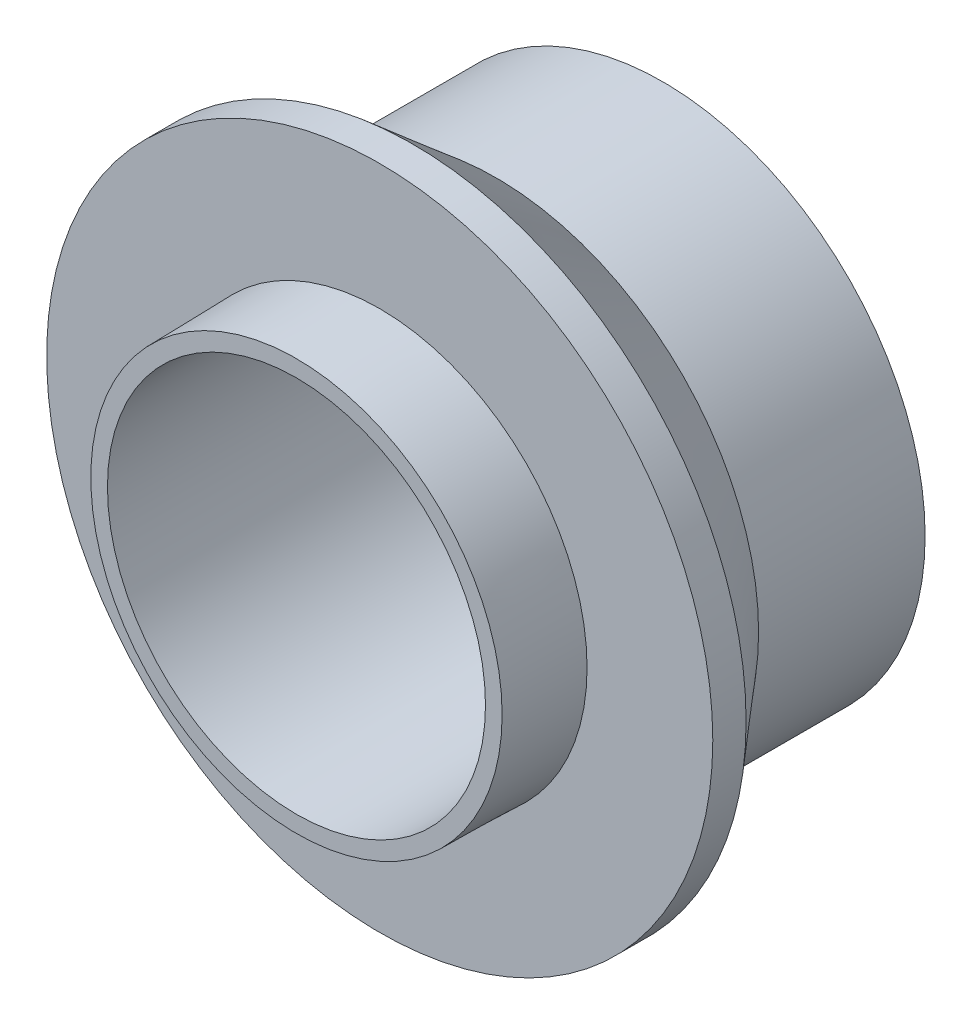
ISO-10303-21;
HEADER;
FILE_DESCRIPTION(('STEP AP214'),'2;1');
FILE_NAME('part.step','',(''),(''),'','','');
FILE_SCHEMA(('AUTOMOTIVE_DESIGN { 1 0 10303 214 1 1 1 1 }'));
ENDSEC;
DATA;
#1=APPLICATION_CONTEXT('core data for automotive mechanical design processes');
#2=APPLICATION_PROTOCOL_DEFINITION('international standard','automotive_design',2000,#1);
#3=PRODUCT_CONTEXT('',#1,'mechanical');
#4=PRODUCT('Part','Part','',(#3));
#5=PRODUCT_RELATED_PRODUCT_CATEGORY('part','',(#4));
#6=PRODUCT_DEFINITION_FORMATION('','',#4);
#7=PRODUCT_DEFINITION_CONTEXT('part definition',#1,'design');
#8=PRODUCT_DEFINITION('design','',#6,#7);
#9=PRODUCT_DEFINITION_SHAPE('','',#8);
#10=(LENGTH_UNIT() NAMED_UNIT(*) SI_UNIT(.MILLI.,.METRE.));
#11=(NAMED_UNIT(*) PLANE_ANGLE_UNIT() SI_UNIT($,.RADIAN.));
#12=(NAMED_UNIT(*) SI_UNIT($,.STERADIAN.) SOLID_ANGLE_UNIT());
#13=UNCERTAINTY_MEASURE_WITH_UNIT(LENGTH_MEASURE(1.E-05),#10,'distance_accuracy_value','');
#14=(GEOMETRIC_REPRESENTATION_CONTEXT(3) GLOBAL_UNCERTAINTY_ASSIGNED_CONTEXT((#13)) GLOBAL_UNIT_ASSIGNED_CONTEXT((#10,
#11,#12)) REPRESENTATION_CONTEXT('',''));
#15=CARTESIAN_POINT('',(0.,0.,0.));
#16=DIRECTION('',(0.,0.,1.));
#17=DIRECTION('',(1.,0.,0.));
#18=AXIS2_PLACEMENT_3D('',#15,#16,#17);
#19=CARTESIAN_POINT('',(0.,0.,17.));
#20=DIRECTION('',(0.,0.,1.));
#21=DIRECTION('',(1.,0.,0.));
#22=AXIS2_PLACEMENT_3D('',#19,#20,#21);
#23=PLANE('',#22);
#24=CARTESIAN_POINT('',(0.,0.,17.));
#25=DIRECTION('',(0.,0.,1.));
#26=DIRECTION('',(1.,0.,0.));
#27=AXIS2_PLACEMENT_3D('',#24,#25,#26);
#28=CIRCLE('',#27,20.);
#29=CARTESIAN_POINT('',(20.,0.,17.));
#30=VERTEX_POINT('',#29);
#31=EDGE_CURVE('E88',#30,#30,#28,.T.);
#32=ORIENTED_EDGE('',*,*,#31,.T.);
#33=EDGE_LOOP('',(#32));
#34=FACE_BOUND('',#33,.T.);
#35=CARTESIAN_POINT('',(0.,0.,17.));
#36=DIRECTION('',(0.,0.,1.));
#37=DIRECTION('',(1.,0.,0.));
#38=AXIS2_PLACEMENT_3D('',#35,#36,#37);
#39=CIRCLE('',#38,12.45);
#40=CARTESIAN_POINT('',(12.45,0.,17.));
#41=VERTEX_POINT('',#40);
#42=EDGE_CURVE('E91',#41,#41,#39,.T.);
#43=ORIENTED_EDGE('',*,*,#42,.F.);
#44=EDGE_LOOP('',(#43));
#45=FACE_BOUND('',#44,.T.);
#46=ADVANCED_FACE('F35',(#34,#45),#23,.T.);
#47=CARTESIAN_POINT('',(0.,0.,10.));
#48=DIRECTION('',(0.,0.,-1.));
#49=DIRECTION('',(-1.,0.,0.));
#50=AXIS2_PLACEMENT_3D('',#47,#48,#49);
#51=CYLINDRICAL_SURFACE('',#50,15.75);
#52=CARTESIAN_POINT('',(0.,0.,10.));
#53=DIRECTION('',(0.,0.,1.));
#54=DIRECTION('',(1.,0.,0.));
#55=AXIS2_PLACEMENT_3D('',#52,#53,#54);
#56=CIRCLE('',#55,15.75);
#57=CARTESIAN_POINT('',(15.75,0.,10.));
#58=VERTEX_POINT('',#57);
#59=EDGE_CURVE('E11',#58,#58,#56,.T.);
#60=ORIENTED_EDGE('',*,*,#59,.F.);
#61=EDGE_LOOP('',(#60));
#62=FACE_BOUND('',#61,.T.);
#63=CARTESIAN_POINT('',(0.,0.,0.));
#64=DIRECTION('',(0.,0.,1.));
#65=DIRECTION('',(1.,0.,0.));
#66=AXIS2_PLACEMENT_3D('',#63,#64,#65);
#67=CIRCLE('',#66,15.75);
#68=CARTESIAN_POINT('',(15.75,0.,0.));
#69=VERTEX_POINT('',#68);
#70=EDGE_CURVE('E44',#69,#69,#67,.T.);
#71=ORIENTED_EDGE('',*,*,#70,.T.);
#72=EDGE_LOOP('',(#71));
#73=FACE_BOUND('',#72,.T.);
#74=ADVANCED_FACE('F37',(#62,#73),#51,.T.);
#75=CARTESIAN_POINT('',(0.,0.,0.));
#76=DIRECTION('',(0.,0.,1.));
#77=DIRECTION('',(1.,0.,0.));
#78=AXIS2_PLACEMENT_3D('',#75,#76,#77);
#79=PLANE('',#78);
#80=CARTESIAN_POINT('',(0.,0.,0.));
#81=DIRECTION('',(0.,0.,1.));
#82=DIRECTION('',(1.,0.,0.));
#83=AXIS2_PLACEMENT_3D('',#80,#81,#82);
#84=CIRCLE('',#83,11.35);
#85=CARTESIAN_POINT('',(11.35,0.,0.));
#86=VERTEX_POINT('',#85);
#87=EDGE_CURVE('E99',#86,#86,#84,.T.);
#88=ORIENTED_EDGE('',*,*,#87,.T.);
#89=EDGE_LOOP('',(#88));
#90=FACE_BOUND('',#89,.T.);
#91=ORIENTED_EDGE('',*,*,#70,.F.);
#92=EDGE_LOOP('',(#91));
#93=FACE_BOUND('',#92,.T.);
#94=ADVANCED_FACE('F75',(#90,#93),#79,.F.);
#95=CARTESIAN_POINT('',(0.,0.,10.));
#96=DIRECTION('',(0.,0.,1.));
#97=DIRECTION('',(1.,0.,0.));
#98=AXIS2_PLACEMENT_3D('',#95,#96,#97);
#99=CONICAL_SURFACE('',#98,15.75,0.704494064242217);
#100=CARTESIAN_POINT('',(0.,0.,15.));
#101=DIRECTION('',(0.,0.,1.));
#102=DIRECTION('',(1.,0.,0.));
#103=AXIS2_PLACEMENT_3D('',#100,#101,#102);
#104=CIRCLE('',#103,20.);
#105=CARTESIAN_POINT('',(20.,0.,15.));
#106=VERTEX_POINT('',#105);
#107=EDGE_CURVE('E39',#106,#106,#104,.T.);
#108=ORIENTED_EDGE('',*,*,#107,.F.);
#109=EDGE_LOOP('',(#108));
#110=FACE_BOUND('',#109,.T.);
#111=ORIENTED_EDGE('',*,*,#59,.T.);
#112=EDGE_LOOP('',(#111));
#113=FACE_BOUND('',#112,.T.);
#114=ADVANCED_FACE('F70',(#110,#113),#99,.T.);
#115=CARTESIAN_POINT('',(0.,0.,17.));
#116=DIRECTION('',(0.,0.,-1.));
#117=DIRECTION('',(-1.,0.,0.));
#118=AXIS2_PLACEMENT_3D('',#115,#116,#117);
#119=CYLINDRICAL_SURFACE('',#118,20.);
#120=ORIENTED_EDGE('',*,*,#31,.F.);
#121=EDGE_LOOP('',(#120));
#122=FACE_BOUND('',#121,.T.);
#123=ORIENTED_EDGE('',*,*,#107,.T.);
#124=EDGE_LOOP('',(#123));
#125=FACE_BOUND('',#124,.T.);
#126=ADVANCED_FACE('F59',(#122,#125),#119,.T.);
#127=CARTESIAN_POINT('',(0.,0.,22.));
#128=DIRECTION('',(0.,0.,1.));
#129=DIRECTION('',(1.,0.,0.));
#130=AXIS2_PLACEMENT_3D('',#127,#128,#129);
#131=PLANE('',#130);
#132=CARTESIAN_POINT('',(0.,0.,22.));
#133=DIRECTION('',(0.,0.,1.));
#134=DIRECTION('',(1.,0.,0.));
#135=AXIS2_PLACEMENT_3D('',#132,#133,#134);
#136=CIRCLE('',#135,11.35);
#137=CARTESIAN_POINT('',(11.35,0.,22.));
#138=VERTEX_POINT('',#137);
#139=EDGE_CURVE('E131',#138,#138,#136,.T.);
#140=ORIENTED_EDGE('',*,*,#139,.F.);
#141=EDGE_LOOP('',(#140));
#142=FACE_BOUND('',#141,.T.);
#143=CARTESIAN_POINT('',(0.,0.,22.));
#144=DIRECTION('',(0.,0.,1.));
#145=DIRECTION('',(1.,0.,0.));
#146=AXIS2_PLACEMENT_3D('',#143,#144,#145);
#147=CIRCLE('',#146,12.35);
#148=CARTESIAN_POINT('',(12.35,0.,22.));
#149=VERTEX_POINT('',#148);
#150=EDGE_CURVE('E94',#149,#149,#147,.T.);
#151=ORIENTED_EDGE('',*,*,#150,.T.);
#152=EDGE_LOOP('',(#151));
#153=FACE_BOUND('',#152,.T.);
#154=ADVANCED_FACE('F69',(#142,#153),#131,.T.);
#155=CARTESIAN_POINT('',(0.,0.,22.));
#156=DIRECTION('',(0.,0.,-1.));
#157=DIRECTION('',(-1.,0.,0.));
#158=AXIS2_PLACEMENT_3D('',#155,#156,#157);
#159=CONICAL_SURFACE('',#158,12.35,0.0199973339731501);
#160=ORIENTED_EDGE('',*,*,#150,.F.);
#161=EDGE_LOOP('',(#160));
#162=FACE_BOUND('',#161,.T.);
#163=ORIENTED_EDGE('',*,*,#42,.T.);
#164=EDGE_LOOP('',(#163));
#165=FACE_BOUND('',#164,.T.);
#166=ADVANCED_FACE('F113',(#162,#165),#159,.T.);
#167=CARTESIAN_POINT('',(0.,0.,-8.));
#168=DIRECTION('',(0.,0.,1.));
#169=DIRECTION('',(1.,0.,0.));
#170=AXIS2_PLACEMENT_3D('',#167,#168,#169);
#171=CYLINDRICAL_SURFACE('',#170,11.35);
#172=ORIENTED_EDGE('',*,*,#139,.T.);
#173=EDGE_LOOP('',(#172));
#174=FACE_BOUND('',#173,.T.);
#175=ORIENTED_EDGE('',*,*,#87,.F.);
#176=EDGE_LOOP('',(#175));
#177=FACE_BOUND('',#176,.T.);
#178=ADVANCED_FACE('F115',(#174,#177),#171,.F.);
#179=CLOSED_SHELL('',(#46,#74,#94,#114,#126,#154,#166,#178));
#180=MANIFOLD_SOLID_BREP('B2',#179);
#181=ADVANCED_BREP_SHAPE_REPRESENTATION('',(#18,#180),#14);
#182=SHAPE_DEFINITION_REPRESENTATION(#9,#181);
ENDSEC;
END-ISO-10303-21;
